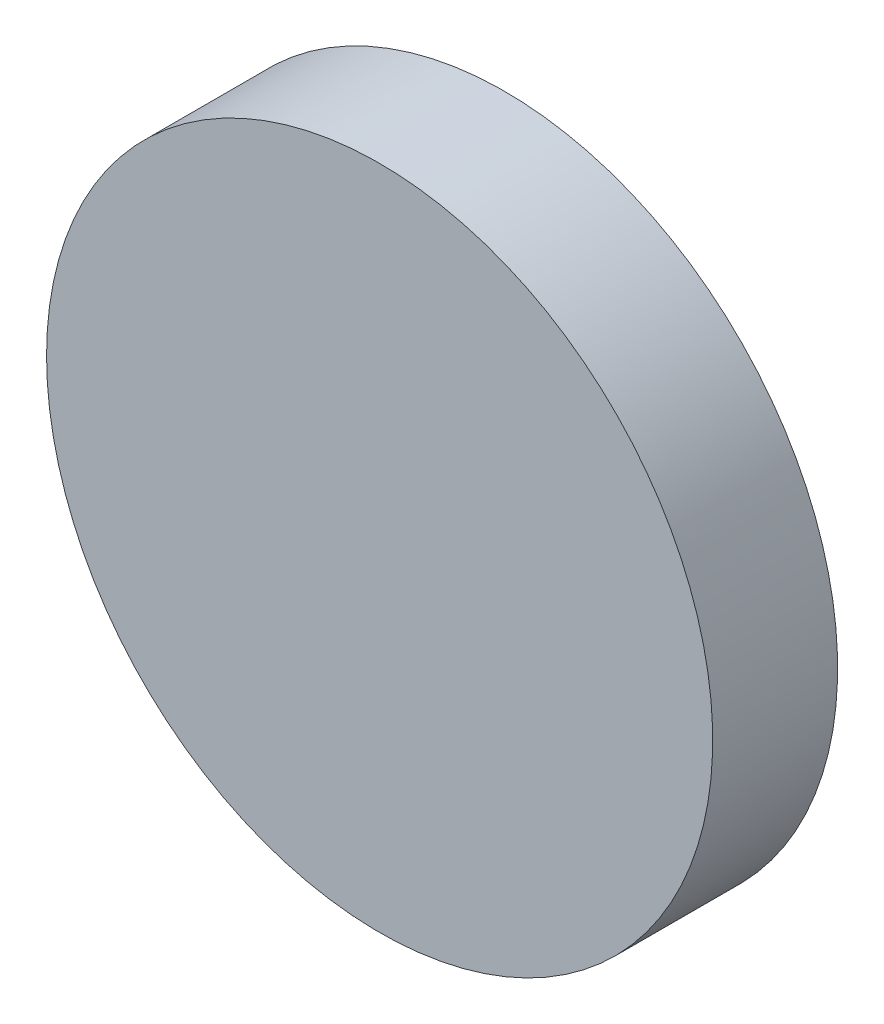
ISO-10303-21;
HEADER;
FILE_DESCRIPTION(('STEP AP214'),'2;1');
FILE_NAME('part.step','',(''),(''),'','','');
FILE_SCHEMA(('AUTOMOTIVE_DESIGN { 1 0 10303 214 1 1 1 1 }'));
ENDSEC;
DATA;
#1=APPLICATION_CONTEXT('core data for automotive mechanical design processes');
#2=APPLICATION_PROTOCOL_DEFINITION('international standard','automotive_design',2000,#1);
#3=PRODUCT_CONTEXT('',#1,'mechanical');
#4=PRODUCT('Part','Part','',(#3));
#5=PRODUCT_RELATED_PRODUCT_CATEGORY('part','',(#4));
#6=PRODUCT_DEFINITION_FORMATION('','',#4);
#7=PRODUCT_DEFINITION_CONTEXT('part definition',#1,'design');
#8=PRODUCT_DEFINITION('design','',#6,#7);
#9=PRODUCT_DEFINITION_SHAPE('','',#8);
#10=(LENGTH_UNIT() NAMED_UNIT(*) SI_UNIT(.MILLI.,.METRE.));
#11=(NAMED_UNIT(*) PLANE_ANGLE_UNIT() SI_UNIT($,.RADIAN.));
#12=(NAMED_UNIT(*) SI_UNIT($,.STERADIAN.) SOLID_ANGLE_UNIT());
#13=UNCERTAINTY_MEASURE_WITH_UNIT(LENGTH_MEASURE(1.E-05),#10,'distance_accuracy_value','');
#14=(GEOMETRIC_REPRESENTATION_CONTEXT(3) GLOBAL_UNCERTAINTY_ASSIGNED_CONTEXT((#13)) GLOBAL_UNIT_ASSIGNED_CONTEXT((#10,
#11,#12)) REPRESENTATION_CONTEXT('',''));
#15=CARTESIAN_POINT('',(0.,0.,0.));
#16=DIRECTION('',(0.,0.,1.));
#17=DIRECTION('',(1.,0.,0.));
#18=AXIS2_PLACEMENT_3D('',#15,#16,#17);
#19=CARTESIAN_POINT('',(0.1999996,0.,0.07500112));
#20=DIRECTION('',(0.,0.,-1.));
#21=DIRECTION('',(-1.,0.,0.));
#22=AXIS2_PLACEMENT_3D('',#19,#20,#21);
#23=PLANE('',#22);
#24=CARTESIAN_POINT('',(0.,0.,0.07500112));
#25=DIRECTION('',(0.,0.,-1.));
#26=DIRECTION('',(-1.,0.,0.));
#27=AXIS2_PLACEMENT_3D('',#24,#25,#26);
#28=CIRCLE('',#27,0.1999996);
#29=CARTESIAN_POINT('',(-0.1999996,0.,0.07500112));
#30=VERTEX_POINT('',#29);
#31=EDGE_CURVE('E18',#30,#30,#28,.T.);
#32=ORIENTED_EDGE('',*,*,#31,.F.);
#33=EDGE_LOOP('',(#32));
#34=FACE_BOUND('',#33,.T.);
#35=ADVANCED_FACE('F15',(#34),#23,.F.);
#36=CARTESIAN_POINT('',(0.,0.,0.));
#37=DIRECTION('',(0.,0.,-1.));
#38=DIRECTION('',(-1.,0.,0.));
#39=AXIS2_PLACEMENT_3D('',#36,#37,#38);
#40=CYLINDRICAL_SURFACE('',#39,0.1999996);
#41=ORIENTED_EDGE('',*,*,#31,.T.);
#42=EDGE_LOOP('',(#41));
#43=FACE_BOUND('',#42,.T.);
#44=CARTESIAN_POINT('',(0.,0.,0.));
#45=DIRECTION('',(0.,0.,-1.));
#46=DIRECTION('',(-1.,0.,0.));
#47=AXIS2_PLACEMENT_3D('',#44,#45,#46);
#48=CIRCLE('',#47,0.1999996);
#49=CARTESIAN_POINT('',(-0.1999996,0.,0.));
#50=VERTEX_POINT('',#49);
#51=EDGE_CURVE('E10',#50,#50,#48,.T.);
#52=ORIENTED_EDGE('',*,*,#51,.F.);
#53=EDGE_LOOP('',(#52));
#54=FACE_BOUND('',#53,.T.);
#55=ADVANCED_FACE('F27',(#43,#54),#40,.T.);
#56=CARTESIAN_POINT('',(0.1999996,0.,0.));
#57=DIRECTION('',(0.,0.,-1.));
#58=DIRECTION('',(-1.,0.,0.));
#59=AXIS2_PLACEMENT_3D('',#56,#57,#58);
#60=PLANE('',#59);
#61=ORIENTED_EDGE('',*,*,#51,.T.);
#62=EDGE_LOOP('',(#61));
#63=FACE_BOUND('',#62,.T.);
#64=ADVANCED_FACE('F35',(#63),#60,.T.);
#65=CLOSED_SHELL('',(#35,#55,#64));
#66=MANIFOLD_SOLID_BREP('B1',#65);
#67=ADVANCED_BREP_SHAPE_REPRESENTATION('',(#18,#66),#14);
#68=SHAPE_DEFINITION_REPRESENTATION(#9,#67);
ENDSEC;
END-ISO-10303-21;
